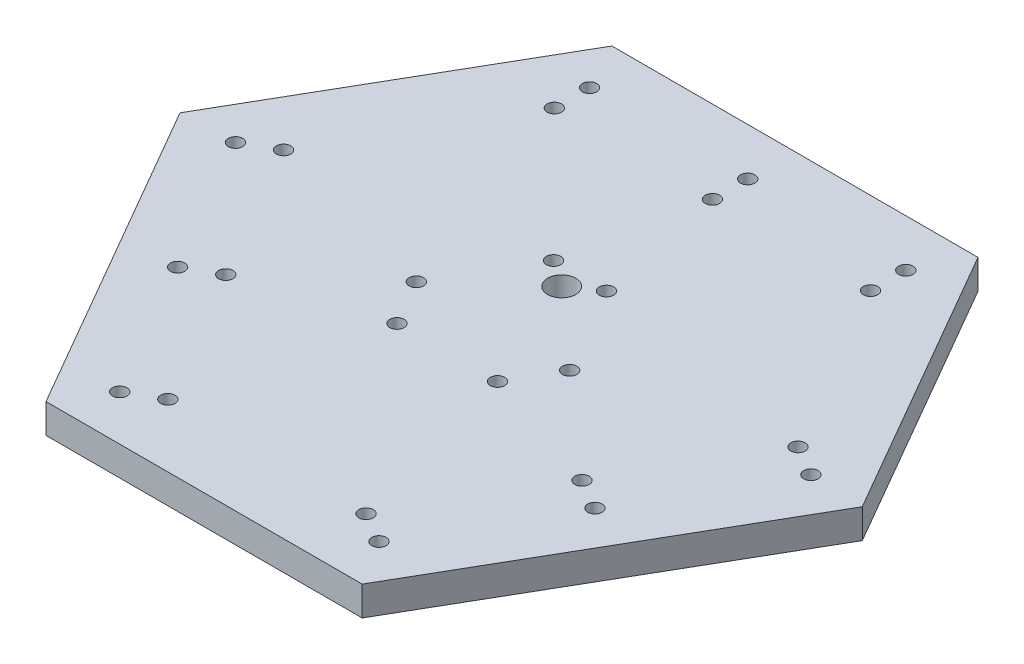
ISO-10303-21;
HEADER;
FILE_DESCRIPTION(('STEP AP214'),'2;1');
FILE_NAME('part.step','',(''),(''),'','','');
FILE_SCHEMA(('AUTOMOTIVE_DESIGN { 1 0 10303 214 1 1 1 1 }'));
ENDSEC;
DATA;
#1=APPLICATION_CONTEXT('core data for automotive mechanical design processes');
#2=APPLICATION_PROTOCOL_DEFINITION('international standard','automotive_design',2000,#1);
#3=PRODUCT_CONTEXT('',#1,'mechanical');
#4=PRODUCT('Part','Part','',(#3));
#5=PRODUCT_RELATED_PRODUCT_CATEGORY('part','',(#4));
#6=PRODUCT_DEFINITION_FORMATION('','',#4);
#7=PRODUCT_DEFINITION_CONTEXT('part definition',#1,'design');
#8=PRODUCT_DEFINITION('design','',#6,#7);
#9=PRODUCT_DEFINITION_SHAPE('','',#8);
#10=(LENGTH_UNIT() NAMED_UNIT(*) SI_UNIT(.MILLI.,.METRE.));
#11=(NAMED_UNIT(*) PLANE_ANGLE_UNIT() SI_UNIT($,.RADIAN.));
#12=(NAMED_UNIT(*) SI_UNIT($,.STERADIAN.) SOLID_ANGLE_UNIT());
#13=UNCERTAINTY_MEASURE_WITH_UNIT(LENGTH_MEASURE(1.E-05),#10,'distance_accuracy_value','');
#14=(GEOMETRIC_REPRESENTATION_CONTEXT(3) GLOBAL_UNCERTAINTY_ASSIGNED_CONTEXT((#13)) GLOBAL_UNIT_ASSIGNED_CONTEXT((#10,
#11,#12)) REPRESENTATION_CONTEXT('',''));
#15=CARTESIAN_POINT('',(0.,0.,0.));
#16=DIRECTION('',(0.,0.,1.));
#17=DIRECTION('',(1.,0.,0.));
#18=AXIS2_PLACEMENT_3D('',#15,#16,#17);
#19=CARTESIAN_POINT('',(0.,10.,196.299091524473));
#20=DIRECTION('',(-0.866025403784439,0.,-0.5));
#21=DIRECTION('',(-0.5,0.,0.866025403784439));
#22=AXIS2_PLACEMENT_3D('',#19,#20,#21);
#23=PLANE('',#22);
#24=DIRECTION('',(0.,1.,0.));
#25=VECTOR('',#24,1.);
#26=CARTESIAN_POINT('',(53.8333333333334,10.,103.057023050348));
#27=LINE('',#26,#25);
#28=CARTESIAN_POINT('',(53.8333333333333,0.,103.057023050348));
#29=VERTEX_POINT('',#28);
#30=CARTESIAN_POINT('',(53.8333333333333,10.,103.057023050348));
#31=VERTEX_POINT('',#30);
#32=EDGE_CURVE('E119',#29,#31,#27,.T.);
#33=ORIENTED_EDGE('',*,*,#32,.F.);
#34=DIRECTION('',(0.5,0.,-0.866025403784439));
#35=VECTOR('',#34,1.);
#36=CARTESIAN_POINT('',(0.,0.,196.299091524473));
#37=LINE('',#36,#35);
#38=CARTESIAN_POINT('',(116.166666666667,0.,-4.90747728811164));
#39=VERTEX_POINT('',#38);
#40=EDGE_CURVE('E104',#29,#39,#37,.T.);
#41=ORIENTED_EDGE('',*,*,#40,.T.);
#42=DIRECTION('',(0.,-1.,0.));
#43=VECTOR('',#42,1.);
#44=CARTESIAN_POINT('',(116.166666666667,10.,-4.90747728811175));
#45=LINE('',#44,#43);
#46=CARTESIAN_POINT('',(116.166666666667,10.,-4.90747728811169));
#47=VERTEX_POINT('',#46);
#48=EDGE_CURVE('E87',#47,#39,#45,.T.);
#49=ORIENTED_EDGE('',*,*,#48,.F.);
#50=DIRECTION('',(0.5,0.,-0.866025403784439));
#51=VECTOR('',#50,1.);
#52=CARTESIAN_POINT('',(0.,10.,196.299091524473));
#53=LINE('',#52,#51);
#54=EDGE_CURVE('E102',#31,#47,#53,.T.);
#55=ORIENTED_EDGE('',*,*,#54,.F.);
#56=EDGE_LOOP('',(#33,#41,#49,#55));
#57=FACE_BOUND('',#56,.T.);
#58=ADVANCED_FACE('F34',(#57),#23,.F.);
#59=CARTESIAN_POINT('',(170.,10.,-98.1495457622364));
#60=DIRECTION('',(0.,0.,1.));
#61=DIRECTION('',(1.,0.,0.));
#62=AXIS2_PLACEMENT_3D('',#59,#60,#61);
#63=PLANE('',#62);
#64=DIRECTION('',(0.,-1.,0.));
#65=VECTOR('',#64,1.);
#66=CARTESIAN_POINT('',(-62.3333333333334,10.,-98.1495457622364));
#67=LINE('',#66,#65);
#68=CARTESIAN_POINT('',(-62.3333333333334,10.,-98.1495457622364));
#69=VERTEX_POINT('',#68);
#70=CARTESIAN_POINT('',(-62.3333333333333,0.,-98.1495457622364));
#71=VERTEX_POINT('',#70);
#72=EDGE_CURVE('E48',#69,#71,#67,.T.);
#73=ORIENTED_EDGE('',*,*,#72,.F.);
#74=DIRECTION('',(-1.,0.,0.));
#75=VECTOR('',#74,1.);
#76=CARTESIAN_POINT('',(170.,10.,-98.1495457622364));
#77=LINE('',#76,#75);
#78=CARTESIAN_POINT('',(62.3333333333333,10.,-98.1495457622364));
#79=VERTEX_POINT('',#78);
#80=EDGE_CURVE('E110',#79,#69,#77,.T.);
#81=ORIENTED_EDGE('',*,*,#80,.F.);
#82=DIRECTION('',(0.,1.,0.));
#83=VECTOR('',#82,1.);
#84=CARTESIAN_POINT('',(62.3333333333333,10.,-98.1495457622364));
#85=LINE('',#84,#83);
#86=CARTESIAN_POINT('',(62.3333333333333,0.,-98.1495457622364));
#87=VERTEX_POINT('',#86);
#88=EDGE_CURVE('E90',#87,#79,#85,.T.);
#89=ORIENTED_EDGE('',*,*,#88,.F.);
#90=DIRECTION('',(-1.,0.,0.));
#91=VECTOR('',#90,1.);
#92=CARTESIAN_POINT('',(170.,0.,-98.1495457622364));
#93=LINE('',#92,#91);
#94=EDGE_CURVE('E116',#87,#71,#93,.T.);
#95=ORIENTED_EDGE('',*,*,#94,.T.);
#96=EDGE_LOOP('',(#73,#81,#89,#95));
#97=FACE_BOUND('',#96,.T.);
#98=ADVANCED_FACE('F371',(#97),#63,.F.);
#99=CARTESIAN_POINT('',(-170.,10.,-98.1495457622364));
#100=DIRECTION('',(0.866025403784439,0.,-0.5));
#101=DIRECTION('',(-0.5,0.,-0.866025403784439));
#102=AXIS2_PLACEMENT_3D('',#99,#100,#101);
#103=PLANE('',#102);
#104=DIRECTION('',(0.,-1.,0.));
#105=VECTOR('',#104,1.);
#106=CARTESIAN_POINT('',(-53.8333333333333,10.,103.057023050348));
#107=LINE('',#106,#105);
#108=CARTESIAN_POINT('',(-53.8333333333333,10.,103.057023050348));
#109=VERTEX_POINT('',#108);
#110=CARTESIAN_POINT('',(-53.8333333333333,0.,103.057023050348));
#111=VERTEX_POINT('',#110);
#112=EDGE_CURVE('E55',#109,#111,#107,.T.);
#113=ORIENTED_EDGE('',*,*,#112,.F.);
#114=DIRECTION('',(0.5,0.,0.866025403784439));
#115=VECTOR('',#114,1.);
#116=CARTESIAN_POINT('',(-170.,10.,-98.1495457622364));
#117=LINE('',#116,#115);
#118=CARTESIAN_POINT('',(-116.166666666667,10.,-4.90747728811181));
#119=VERTEX_POINT('',#118);
#120=EDGE_CURVE('E113',#119,#109,#117,.T.);
#121=ORIENTED_EDGE('',*,*,#120,.F.);
#122=DIRECTION('',(0.,1.,0.));
#123=VECTOR('',#122,1.);
#124=CARTESIAN_POINT('',(-116.166666666667,10.,-4.90747728811187));
#125=LINE('',#124,#123);
#126=CARTESIAN_POINT('',(-116.166666666667,0.,-4.90747728811181));
#127=VERTEX_POINT('',#126);
#128=EDGE_CURVE('E105',#127,#119,#125,.T.);
#129=ORIENTED_EDGE('',*,*,#128,.F.);
#130=DIRECTION('',(0.5,0.,0.866025403784439));
#131=VECTOR('',#130,1.);
#132=CARTESIAN_POINT('',(-170.,0.,-98.1495457622364));
#133=LINE('',#132,#131);
#134=EDGE_CURVE('E111',#127,#111,#133,.T.);
#135=ORIENTED_EDGE('',*,*,#134,.T.);
#136=EDGE_LOOP('',(#113,#121,#129,#135));
#137=FACE_BOUND('',#136,.T.);
#138=ADVANCED_FACE('F135',(#137),#103,.F.);
#139=CARTESIAN_POINT('',(0.,10.,0.));
#140=DIRECTION('',(0.,1.,0.));
#141=DIRECTION('',(0.,0.,1.));
#142=AXIS2_PLACEMENT_3D('',#139,#140,#141);
#143=PLANE('',#142);
#144=CARTESIAN_POINT('',(26.1069404429791,10.,4.6805442470582));
#145=DIRECTION('',(0.,1.,0.));
#146=DIRECTION('',(0.,0.,1.));
#147=AXIS2_PLACEMENT_3D('',#144,#145,#146);
#148=CIRCLE('',#147,2.45);
#149=CARTESIAN_POINT('',(26.1069404429791,10.,7.1305442470582));
#150=VERTEX_POINT('',#149);
#151=EDGE_CURVE('E284',#150,#150,#148,.T.);
#152=ORIENTED_EDGE('',*,*,#151,.F.);
#153=EDGE_LOOP('',(#152));
#154=FACE_BOUND('',#153,.T.);
#155=CARTESIAN_POINT('',(9.,10.,-24.9495457622364));
#156=DIRECTION('',(0.,1.,0.));
#157=DIRECTION('',(0.,0.,1.));
#158=AXIS2_PLACEMENT_3D('',#155,#156,#157);
#159=CIRCLE('',#158,2.45);
#160=CARTESIAN_POINT('',(9.,10.,-22.4995457622364));
#161=VERTEX_POINT('',#160);
#162=EDGE_CURVE('E285',#161,#161,#159,.T.);
#163=ORIENTED_EDGE('',*,*,#162,.F.);
#164=EDGE_LOOP('',(#163));
#165=FACE_BOUND('',#164,.T.);
#166=CARTESIAN_POINT('',(-9.00000000000001,10.,-24.9495457622364));
#167=DIRECTION('',(0.,1.,0.));
#168=DIRECTION('',(0.,0.,1.));
#169=AXIS2_PLACEMENT_3D('',#166,#167,#168);
#170=CIRCLE('',#169,2.45);
#171=CARTESIAN_POINT('',(-9.00000000000001,10.,-22.4995457622364));
#172=VERTEX_POINT('',#171);
#173=EDGE_CURVE('E259',#172,#172,#170,.T.);
#174=ORIENTED_EDGE('',*,*,#173,.F.);
#175=EDGE_LOOP('',(#174));
#176=FACE_BOUND('',#175,.T.);
#177=CARTESIAN_POINT('',(-26.1069404429791,10.,4.68054424705822));
#178=DIRECTION('',(0.,1.,0.));
#179=DIRECTION('',(0.,0.,1.));
#180=AXIS2_PLACEMENT_3D('',#177,#178,#179);
#181=CIRCLE('',#180,2.45);
#182=CARTESIAN_POINT('',(-26.1069404429791,10.,7.13054424705822));
#183=VERTEX_POINT('',#182);
#184=EDGE_CURVE('E266',#183,#183,#181,.T.);
#185=ORIENTED_EDGE('',*,*,#184,.F.);
#186=EDGE_LOOP('',(#185));
#187=FACE_BOUND('',#186,.T.);
#188=CARTESIAN_POINT('',(-17.1069404429791,10.,20.2690015151781));
#189=DIRECTION('',(0.,1.,0.));
#190=DIRECTION('',(0.,0.,1.));
#191=AXIS2_PLACEMENT_3D('',#188,#189,#190);
#192=CIRCLE('',#191,2.45);
#193=CARTESIAN_POINT('',(-17.1069404429791,10.,22.7190015151781));
#194=VERTEX_POINT('',#193);
#195=EDGE_CURVE('E272',#194,#194,#192,.T.);
#196=ORIENTED_EDGE('',*,*,#195,.F.);
#197=EDGE_LOOP('',(#196));
#198=FACE_BOUND('',#197,.T.);
#199=CARTESIAN_POINT('',(17.1069404429791,10.,20.2690015151781));
#200=DIRECTION('',(0.,1.,0.));
#201=DIRECTION('',(0.,0.,1.));
#202=AXIS2_PLACEMENT_3D('',#199,#200,#201);
#203=CIRCLE('',#202,2.45);
#204=CARTESIAN_POINT('',(17.1069404429791,10.,22.7190015151781));
#205=VERTEX_POINT('',#204);
#206=EDGE_CURVE('E278',#205,#205,#203,.T.);
#207=ORIENTED_EDGE('',*,*,#206,.F.);
#208=EDGE_LOOP('',(#207));
#209=FACE_BOUND('',#208,.T.);
#210=CARTESIAN_POINT('',(97.9773861328657,10.,-5.60271925044493));
#211=DIRECTION('',(0.,1.,0.));
#212=DIRECTION('',(0.,0.,1.));
#213=AXIS2_PLACEMENT_3D('',#210,#211,#212);
#214=CIRCLE('',#213,2.45);
#215=CARTESIAN_POINT('',(97.9773861328657,10.,-3.15271925044493));
#216=VERTEX_POINT('',#215);
#217=EDGE_CURVE('E217',#216,#216,#214,.T.);
#218=ORIENTED_EDGE('',*,*,#217,.F.);
#219=EDGE_LOOP('',(#218));
#220=FACE_BOUND('',#219,.T.);
#221=CARTESIAN_POINT('',(53.8407902675903,10.,-70.0495457622364));
#222=DIRECTION('',(0.,1.,0.));
#223=DIRECTION('',(0.,0.,1.));
#224=AXIS2_PLACEMENT_3D('',#221,#222,#223);
#225=CIRCLE('',#224,2.45);
#226=CARTESIAN_POINT('',(53.8407902675903,10.,-67.5995457622364));
#227=VERTEX_POINT('',#226);
#228=EDGE_CURVE('E224',#227,#227,#225,.T.);
#229=ORIENTED_EDGE('',*,*,#228,.F.);
#230=EDGE_LOOP('',(#229));
#231=FACE_BOUND('',#230,.T.);
#232=CARTESIAN_POINT('',(53.8407902675903,10.,-82.0495457622364));
#233=DIRECTION('',(0.,1.,0.));
#234=DIRECTION('',(0.,0.,1.));
#235=AXIS2_PLACEMENT_3D('',#232,#233,#234);
#236=CIRCLE('',#235,2.45000000000001);
#237=CARTESIAN_POINT('',(53.8407902675903,10.,-79.5995457622364));
#238=VERTEX_POINT('',#237);
#239=EDGE_CURVE('E205',#238,#238,#236,.T.);
#240=ORIENTED_EDGE('',*,*,#239,.F.);
#241=EDGE_LOOP('',(#240));
#242=FACE_BOUND('',#241,.T.);
#243=CARTESIAN_POINT('',(-97.9773861328657,10.,-5.60271925044487));
#244=DIRECTION('',(0.,1.,0.));
#245=DIRECTION('',(0.,0.,1.));
#246=AXIS2_PLACEMENT_3D('',#243,#244,#245);
#247=CIRCLE('',#246,2.45);
#248=CARTESIAN_POINT('',(-97.9773861328657,10.,-3.15271925044487));
#249=VERTEX_POINT('',#248);
#250=EDGE_CURVE('E212',#249,#249,#247,.T.);
#251=ORIENTED_EDGE('',*,*,#250,.F.);
#252=EDGE_LOOP('',(#251));
#253=FACE_BOUND('',#252,.T.);
#254=CARTESIAN_POINT('',(87.5850812874524,10.,-11.6027192504449));
#255=DIRECTION('',(0.,1.,0.));
#256=DIRECTION('',(0.,0.,1.));
#257=AXIS2_PLACEMENT_3D('',#254,#255,#256);
#258=CIRCLE('',#257,2.45);
#259=CARTESIAN_POINT('',(87.5850812874524,10.,-9.15271925044494));
#260=VERTEX_POINT('',#259);
#261=EDGE_CURVE('E248',#260,#260,#258,.T.);
#262=ORIENTED_EDGE('',*,*,#261,.F.);
#263=EDGE_LOOP('',(#262));
#264=FACE_BOUND('',#263,.T.);
#265=CARTESIAN_POINT('',(44.1365958652754,10.,87.6522650126813));
#266=DIRECTION('',(0.,1.,0.));
#267=DIRECTION('',(0.,0.,1.));
#268=AXIS2_PLACEMENT_3D('',#265,#266,#267);
#269=CIRCLE('',#268,2.45);
#270=CARTESIAN_POINT('',(44.1365958652754,10.,90.1022650126813));
#271=VERTEX_POINT('',#270);
#272=EDGE_CURVE('E242',#271,#271,#269,.T.);
#273=ORIENTED_EDGE('',*,*,#272,.F.);
#274=EDGE_LOOP('',(#273));
#275=FACE_BOUND('',#274,.T.);
#276=CARTESIAN_POINT('',(33.7442910198621,10.,81.6522650126813));
#277=DIRECTION('',(0.,1.,0.));
#278=DIRECTION('',(0.,0.,1.));
#279=AXIS2_PLACEMENT_3D('',#276,#277,#278);
#280=CIRCLE('',#279,2.45);
#281=CARTESIAN_POINT('',(33.7442910198621,10.,84.1022650126813));
#282=VERTEX_POINT('',#281);
#283=EDGE_CURVE('E236',#282,#282,#280,.T.);
#284=ORIENTED_EDGE('',*,*,#283,.F.);
#285=EDGE_LOOP('',(#284));
#286=FACE_BOUND('',#285,.T.);
#287=CARTESIAN_POINT('',(-33.7442910198621,10.,81.6522650126813));
#288=DIRECTION('',(0.,1.,0.));
#289=DIRECTION('',(0.,0.,1.));
#290=AXIS2_PLACEMENT_3D('',#287,#288,#289);
#291=CIRCLE('',#290,2.45);
#292=CARTESIAN_POINT('',(-33.7442910198621,10.,84.1022650126813));
#293=VERTEX_POINT('',#292);
#294=EDGE_CURVE('E229',#293,#293,#291,.T.);
#295=ORIENTED_EDGE('',*,*,#294,.F.);
#296=EDGE_LOOP('',(#295));
#297=FACE_BOUND('',#296,.T.);
#298=CARTESIAN_POINT('',(-53.8407902675903,10.,-82.0495457622364));
#299=DIRECTION('',(0.,1.,0.));
#300=DIRECTION('',(0.,0.,1.));
#301=AXIS2_PLACEMENT_3D('',#298,#299,#300);
#302=CIRCLE('',#301,2.45000000000001);
#303=CARTESIAN_POINT('',(-53.8407902675903,10.,-79.5995457622364));
#304=VERTEX_POINT('',#303);
#305=EDGE_CURVE('E176',#304,#304,#302,.T.);
#306=ORIENTED_EDGE('',*,*,#305,.F.);
#307=EDGE_LOOP('',(#306));
#308=FACE_BOUND('',#307,.T.);
#309=CARTESIAN_POINT('',(0.,10.,-70.0495457622364));
#310=DIRECTION('',(0.,1.,0.));
#311=DIRECTION('',(0.,0.,1.));
#312=AXIS2_PLACEMENT_3D('',#309,#310,#311);
#313=CIRCLE('',#312,2.45);
#314=CARTESIAN_POINT('',(0.,10.,-67.5995457622364));
#315=VERTEX_POINT('',#314);
#316=EDGE_CURVE('E170',#315,#315,#313,.T.);
#317=ORIENTED_EDGE('',*,*,#316,.F.);
#318=EDGE_LOOP('',(#317));
#319=FACE_BOUND('',#318,.T.);
#320=CARTESIAN_POINT('',(71.0569909990705,10.,41.0247728811182));
#321=DIRECTION('',(0.,1.,0.));
#322=DIRECTION('',(0.,0.,1.));
#323=AXIS2_PLACEMENT_3D('',#320,#321,#322);
#324=CIRCLE('',#323,2.45000000000001);
#325=CARTESIAN_POINT('',(71.0569909990705,10.,43.4747728811182));
#326=VERTEX_POINT('',#325);
#327=EDGE_CURVE('E164',#326,#326,#324,.T.);
#328=ORIENTED_EDGE('',*,*,#327,.F.);
#329=EDGE_LOOP('',(#328));
#330=FACE_BOUND('',#329,.T.);
#331=CARTESIAN_POINT('',(60.6646861536573,10.,35.0247728811182));
#332=DIRECTION('',(0.,1.,0.));
#333=DIRECTION('',(0.,0.,1.));
#334=AXIS2_PLACEMENT_3D('',#331,#332,#333);
#335=CIRCLE('',#334,2.45);
#336=CARTESIAN_POINT('',(60.6646861536573,10.,37.4747728811182));
#337=VERTEX_POINT('',#336);
#338=EDGE_CURVE('E157',#337,#337,#335,.T.);
#339=ORIENTED_EDGE('',*,*,#338,.F.);
#340=EDGE_LOOP('',(#339));
#341=FACE_BOUND('',#340,.T.);
#342=CARTESIAN_POINT('',(-71.0569909990705,10.,41.0247728811182));
#343=DIRECTION('',(0.,1.,0.));
#344=DIRECTION('',(0.,0.,1.));
#345=AXIS2_PLACEMENT_3D('',#342,#343,#344);
#346=CIRCLE('',#345,2.45);
#347=CARTESIAN_POINT('',(-71.0569909990705,10.,43.4747728811182));
#348=VERTEX_POINT('',#347);
#349=EDGE_CURVE('E200',#348,#348,#346,.T.);
#350=ORIENTED_EDGE('',*,*,#349,.F.);
#351=EDGE_LOOP('',(#350));
#352=FACE_BOUND('',#351,.T.);
#353=CARTESIAN_POINT('',(-60.6646861536573,10.,35.0247728811182));
#354=DIRECTION('',(0.,1.,0.));
#355=DIRECTION('',(0.,0.,1.));
#356=AXIS2_PLACEMENT_3D('',#353,#354,#355);
#357=CIRCLE('',#356,2.45);
#358=CARTESIAN_POINT('',(-60.6646861536573,10.,37.4747728811182));
#359=VERTEX_POINT('',#358);
#360=EDGE_CURVE('E194',#359,#359,#357,.T.);
#361=ORIENTED_EDGE('',*,*,#360,.F.);
#362=EDGE_LOOP('',(#361));
#363=FACE_BOUND('',#362,.T.);
#364=CARTESIAN_POINT('',(-53.8407902675903,10.,-70.0495457622364));
#365=DIRECTION('',(0.,1.,0.));
#366=DIRECTION('',(0.,0.,1.));
#367=AXIS2_PLACEMENT_3D('',#364,#365,#366);
#368=CIRCLE('',#367,2.45);
#369=CARTESIAN_POINT('',(-53.8407902675903,10.,-67.5995457622364));
#370=VERTEX_POINT('',#369);
#371=EDGE_CURVE('E188',#370,#370,#368,.T.);
#372=ORIENTED_EDGE('',*,*,#371,.F.);
#373=EDGE_LOOP('',(#372));
#374=FACE_BOUND('',#373,.T.);
#375=CARTESIAN_POINT('',(-87.5850812874524,10.,-11.6027192504449));
#376=DIRECTION('',(0.,1.,0.));
#377=DIRECTION('',(0.,0.,1.));
#378=AXIS2_PLACEMENT_3D('',#375,#376,#377);
#379=CIRCLE('',#378,2.45);
#380=CARTESIAN_POINT('',(-87.5850812874524,10.,-9.15271925044489));
#381=VERTEX_POINT('',#380);
#382=EDGE_CURVE('E181',#381,#381,#379,.T.);
#383=ORIENTED_EDGE('',*,*,#382,.F.);
#384=EDGE_LOOP('',(#383));
#385=FACE_BOUND('',#384,.T.);
#386=CARTESIAN_POINT('',(-44.1365958652753,10.,87.6522650126813));
#387=DIRECTION('',(0.,1.,0.));
#388=DIRECTION('',(0.,0.,1.));
#389=AXIS2_PLACEMENT_3D('',#386,#387,#388);
#390=CIRCLE('',#389,2.45000000000001);
#391=CARTESIAN_POINT('',(-44.1365958652753,10.,90.1022650126813));
#392=VERTEX_POINT('',#391);
#393=EDGE_CURVE('E253',#392,#392,#390,.T.);
#394=ORIENTED_EDGE('',*,*,#393,.F.);
#395=EDGE_LOOP('',(#394));
#396=FACE_BOUND('',#395,.T.);
#397=CARTESIAN_POINT('',(0.,10.,-82.0495457622364));
#398=DIRECTION('',(0.,1.,0.));
#399=DIRECTION('',(0.,0.,1.));
#400=AXIS2_PLACEMENT_3D('',#397,#398,#399);
#401=CIRCLE('',#400,2.45);
#402=CARTESIAN_POINT('',(0.,10.,-79.5995457622364));
#403=VERTEX_POINT('',#402);
#404=EDGE_CURVE('E151',#403,#403,#401,.T.);
#405=ORIENTED_EDGE('',*,*,#404,.F.);
#406=EDGE_LOOP('',(#405));
#407=FACE_BOUND('',#406,.T.);
#408=CARTESIAN_POINT('',(0.,10.,-18.7137234561684));
#409=DIRECTION('',(0.,1.,0.));
#410=DIRECTION('',(0.,0.,1.));
#411=AXIS2_PLACEMENT_3D('',#408,#409,#410);
#412=CIRCLE('',#411,4.80066582730917);
#413=CARTESIAN_POINT('',(0.,10.,-13.9130576288592));
#414=VERTEX_POINT('',#413);
#415=EDGE_CURVE('E145',#414,#414,#412,.T.);
#416=ORIENTED_EDGE('',*,*,#415,.F.);
#417=EDGE_LOOP('',(#416));
#418=FACE_BOUND('',#417,.T.);
#419=ORIENTED_EDGE('',*,*,#120,.T.);
#420=DIRECTION('',(1.,0.,0.));
#421=VECTOR('',#420,1.);
#422=CARTESIAN_POINT('',(-178.5,10.,103.057023050348));
#423=LINE('',#422,#421);
#424=EDGE_CURVE('E96',#109,#31,#423,.T.);
#425=ORIENTED_EDGE('',*,*,#424,.T.);
#426=ORIENTED_EDGE('',*,*,#54,.T.);
#427=DIRECTION('',(-0.5,0.,-0.866025403784439));
#428=VECTOR('',#427,1.);
#429=CARTESIAN_POINT('',(178.5,10.,103.057023050348));
#430=LINE('',#429,#428);
#431=EDGE_CURVE('E84',#47,#79,#430,.T.);
#432=ORIENTED_EDGE('',*,*,#431,.T.);
#433=ORIENTED_EDGE('',*,*,#80,.T.);
#434=DIRECTION('',(-0.5,0.,0.866025403784439));
#435=VECTOR('',#434,1.);
#436=CARTESIAN_POINT('',(0.,10.,-206.114046100696));
#437=LINE('',#436,#435);
#438=EDGE_CURVE('E95',#69,#119,#437,.T.);
#439=ORIENTED_EDGE('',*,*,#438,.T.);
#440=EDGE_LOOP('',(#419,#425,#426,#432,#433,#439));
#441=FACE_BOUND('',#440,.T.);
#442=ADVANCED_FACE('F109',(#154,#165,#176,#187,#198,#209,#220,#231,#242,#253,#264,#275,#286,
#297,#308,#319,#330,#341,#352,#363,#374,#385,#396,#407,#418,#441),#143,.T.);
#443=CARTESIAN_POINT('',(0.,0.,0.));
#444=DIRECTION('',(0.,1.,0.));
#445=DIRECTION('',(0.,0.,1.));
#446=AXIS2_PLACEMENT_3D('',#443,#444,#445);
#447=PLANE('',#446);
#448=CARTESIAN_POINT('',(26.1069404429791,0.,4.6805442470582));
#449=DIRECTION('',(0.,1.,0.));
#450=DIRECTION('',(0.,0.,1.));
#451=AXIS2_PLACEMENT_3D('',#448,#449,#450);
#452=CIRCLE('',#451,2.45);
#453=CARTESIAN_POINT('',(26.1069404429791,0.,7.1305442470582));
#454=VERTEX_POINT('',#453);
#455=EDGE_CURVE('E256',#454,#454,#452,.T.);
#456=ORIENTED_EDGE('',*,*,#455,.T.);
#457=EDGE_LOOP('',(#456));
#458=FACE_BOUND('',#457,.T.);
#459=CARTESIAN_POINT('',(9.,0.,-24.9495457622364));
#460=DIRECTION('',(0.,1.,0.));
#461=DIRECTION('',(0.,0.,1.));
#462=AXIS2_PLACEMENT_3D('',#459,#460,#461);
#463=CIRCLE('',#462,2.45);
#464=CARTESIAN_POINT('',(9.,0.,-22.4995457622364));
#465=VERTEX_POINT('',#464);
#466=EDGE_CURVE('E263',#465,#465,#463,.T.);
#467=ORIENTED_EDGE('',*,*,#466,.T.);
#468=EDGE_LOOP('',(#467));
#469=FACE_BOUND('',#468,.T.);
#470=CARTESIAN_POINT('',(-9.00000000000001,0.,-24.9495457622364));
#471=DIRECTION('',(0.,1.,0.));
#472=DIRECTION('',(0.,0.,1.));
#473=AXIS2_PLACEMENT_3D('',#470,#471,#472);
#474=CIRCLE('',#473,2.45);
#475=CARTESIAN_POINT('',(-9.00000000000001,0.,-22.4995457622364));
#476=VERTEX_POINT('',#475);
#477=EDGE_CURVE('E262',#476,#476,#474,.T.);
#478=ORIENTED_EDGE('',*,*,#477,.T.);
#479=EDGE_LOOP('',(#478));
#480=FACE_BOUND('',#479,.T.);
#481=CARTESIAN_POINT('',(-26.1069404429791,0.,4.68054424705822));
#482=DIRECTION('',(0.,1.,0.));
#483=DIRECTION('',(0.,0.,1.));
#484=AXIS2_PLACEMENT_3D('',#481,#482,#483);
#485=CIRCLE('',#484,2.45);
#486=CARTESIAN_POINT('',(-26.1069404429791,0.,7.13054424705822));
#487=VERTEX_POINT('',#486);
#488=EDGE_CURVE('E269',#487,#487,#485,.T.);
#489=ORIENTED_EDGE('',*,*,#488,.T.);
#490=EDGE_LOOP('',(#489));
#491=FACE_BOUND('',#490,.T.);
#492=CARTESIAN_POINT('',(-17.1069404429791,0.,20.2690015151781));
#493=DIRECTION('',(0.,1.,0.));
#494=DIRECTION('',(0.,0.,1.));
#495=AXIS2_PLACEMENT_3D('',#492,#493,#494);
#496=CIRCLE('',#495,2.45);
#497=CARTESIAN_POINT('',(-17.1069404429791,0.,22.7190015151781));
#498=VERTEX_POINT('',#497);
#499=EDGE_CURVE('E275',#498,#498,#496,.T.);
#500=ORIENTED_EDGE('',*,*,#499,.T.);
#501=EDGE_LOOP('',(#500));
#502=FACE_BOUND('',#501,.T.);
#503=CARTESIAN_POINT('',(17.1069404429791,0.,20.2690015151781));
#504=DIRECTION('',(0.,1.,0.));
#505=DIRECTION('',(0.,0.,1.));
#506=AXIS2_PLACEMENT_3D('',#503,#504,#505);
#507=CIRCLE('',#506,2.45);
#508=CARTESIAN_POINT('',(17.1069404429791,0.,22.7190015151781));
#509=VERTEX_POINT('',#508);
#510=EDGE_CURVE('E281',#509,#509,#507,.T.);
#511=ORIENTED_EDGE('',*,*,#510,.T.);
#512=EDGE_LOOP('',(#511));
#513=FACE_BOUND('',#512,.T.);
#514=CARTESIAN_POINT('',(97.9773861328657,0.,-5.60271925044493));
#515=DIRECTION('',(0.,1.,0.));
#516=DIRECTION('',(0.,0.,1.));
#517=AXIS2_PLACEMENT_3D('',#514,#515,#516);
#518=CIRCLE('',#517,2.45);
#519=CARTESIAN_POINT('',(97.9773861328657,0.,-3.15271925044493));
#520=VERTEX_POINT('',#519);
#521=EDGE_CURVE('E220',#520,#520,#518,.T.);
#522=ORIENTED_EDGE('',*,*,#521,.T.);
#523=EDGE_LOOP('',(#522));
#524=FACE_BOUND('',#523,.T.);
#525=CARTESIAN_POINT('',(53.8407902675903,0.,-70.0495457622364));
#526=DIRECTION('',(0.,1.,0.));
#527=DIRECTION('',(0.,0.,1.));
#528=AXIS2_PLACEMENT_3D('',#525,#526,#527);
#529=CIRCLE('',#528,2.45);
#530=CARTESIAN_POINT('',(53.8407902675903,0.,-67.5995457622364));
#531=VERTEX_POINT('',#530);
#532=EDGE_CURVE('E209',#531,#531,#529,.T.);
#533=ORIENTED_EDGE('',*,*,#532,.T.);
#534=EDGE_LOOP('',(#533));
#535=FACE_BOUND('',#534,.T.);
#536=CARTESIAN_POINT('',(53.8407902675903,0.,-82.0495457622364));
#537=DIRECTION('',(0.,1.,0.));
#538=DIRECTION('',(0.,0.,1.));
#539=AXIS2_PLACEMENT_3D('',#536,#537,#538);
#540=CIRCLE('',#539,2.45000000000001);
#541=CARTESIAN_POINT('',(53.8407902675903,0.,-79.5995457622364));
#542=VERTEX_POINT('',#541);
#543=EDGE_CURVE('E208',#542,#542,#540,.T.);
#544=ORIENTED_EDGE('',*,*,#543,.T.);
#545=EDGE_LOOP('',(#544));
#546=FACE_BOUND('',#545,.T.);
#547=CARTESIAN_POINT('',(-97.9773861328657,0.,-5.60271925044487));
#548=DIRECTION('',(0.,1.,0.));
#549=DIRECTION('',(0.,0.,1.));
#550=AXIS2_PLACEMENT_3D('',#547,#548,#549);
#551=CIRCLE('',#550,2.45);
#552=CARTESIAN_POINT('',(-97.9773861328657,0.,-3.15271925044487));
#553=VERTEX_POINT('',#552);
#554=EDGE_CURVE('E185',#553,#553,#551,.T.);
#555=ORIENTED_EDGE('',*,*,#554,.T.);
#556=EDGE_LOOP('',(#555));
#557=FACE_BOUND('',#556,.T.);
#558=CARTESIAN_POINT('',(87.5850812874524,0.,-11.6027192504449));
#559=DIRECTION('',(0.,1.,0.));
#560=DIRECTION('',(0.,0.,1.));
#561=AXIS2_PLACEMENT_3D('',#558,#559,#560);
#562=CIRCLE('',#561,2.45);
#563=CARTESIAN_POINT('',(87.5850812874524,0.,-9.15271925044494));
#564=VERTEX_POINT('',#563);
#565=EDGE_CURVE('E221',#564,#564,#562,.T.);
#566=ORIENTED_EDGE('',*,*,#565,.T.);
#567=EDGE_LOOP('',(#566));
#568=FACE_BOUND('',#567,.T.);
#569=CARTESIAN_POINT('',(44.1365958652754,0.,87.6522650126813));
#570=DIRECTION('',(0.,1.,0.));
#571=DIRECTION('',(0.,0.,1.));
#572=AXIS2_PLACEMENT_3D('',#569,#570,#571);
#573=CIRCLE('',#572,2.45);
#574=CARTESIAN_POINT('',(44.1365958652754,0.,90.1022650126813));
#575=VERTEX_POINT('',#574);
#576=EDGE_CURVE('E245',#575,#575,#573,.T.);
#577=ORIENTED_EDGE('',*,*,#576,.T.);
#578=EDGE_LOOP('',(#577));
#579=FACE_BOUND('',#578,.T.);
#580=CARTESIAN_POINT('',(33.7442910198621,0.,81.6522650126813));
#581=DIRECTION('',(0.,1.,0.));
#582=DIRECTION('',(0.,0.,1.));
#583=AXIS2_PLACEMENT_3D('',#580,#581,#582);
#584=CIRCLE('',#583,2.45);
#585=CARTESIAN_POINT('',(33.7442910198621,0.,84.1022650126813));
#586=VERTEX_POINT('',#585);
#587=EDGE_CURVE('E239',#586,#586,#584,.T.);
#588=ORIENTED_EDGE('',*,*,#587,.T.);
#589=EDGE_LOOP('',(#588));
#590=FACE_BOUND('',#589,.T.);
#591=CARTESIAN_POINT('',(-33.7442910198621,0.,81.6522650126813));
#592=DIRECTION('',(0.,1.,0.));
#593=DIRECTION('',(0.,0.,1.));
#594=AXIS2_PLACEMENT_3D('',#591,#592,#593);
#595=CIRCLE('',#594,2.45);
#596=CARTESIAN_POINT('',(-33.7442910198621,0.,84.1022650126813));
#597=VERTEX_POINT('',#596);
#598=EDGE_CURVE('E232',#597,#597,#595,.T.);
#599=ORIENTED_EDGE('',*,*,#598,.T.);
#600=EDGE_LOOP('',(#599));
#601=FACE_BOUND('',#600,.T.);
#602=CARTESIAN_POINT('',(-53.8407902675903,0.,-82.0495457622364));
#603=DIRECTION('',(0.,1.,0.));
#604=DIRECTION('',(0.,0.,1.));
#605=AXIS2_PLACEMENT_3D('',#602,#603,#604);
#606=CIRCLE('',#605,2.45000000000001);
#607=CARTESIAN_POINT('',(-53.8407902675903,0.,-79.5995457622364));
#608=VERTEX_POINT('',#607);
#609=EDGE_CURVE('E154',#608,#608,#606,.T.);
#610=ORIENTED_EDGE('',*,*,#609,.T.);
#611=EDGE_LOOP('',(#610));
#612=FACE_BOUND('',#611,.T.);
#613=CARTESIAN_POINT('',(0.,0.,-70.0495457622364));
#614=DIRECTION('',(0.,1.,0.));
#615=DIRECTION('',(0.,0.,1.));
#616=AXIS2_PLACEMENT_3D('',#613,#614,#615);
#617=CIRCLE('',#616,2.45);
#618=CARTESIAN_POINT('',(0.,0.,-67.5995457622364));
#619=VERTEX_POINT('',#618);
#620=EDGE_CURVE('E173',#619,#619,#617,.T.);
#621=ORIENTED_EDGE('',*,*,#620,.T.);
#622=EDGE_LOOP('',(#621));
#623=FACE_BOUND('',#622,.T.);
#624=CARTESIAN_POINT('',(71.0569909990705,0.,41.0247728811182));
#625=DIRECTION('',(0.,1.,0.));
#626=DIRECTION('',(0.,0.,1.));
#627=AXIS2_PLACEMENT_3D('',#624,#625,#626);
#628=CIRCLE('',#627,2.45000000000001);
#629=CARTESIAN_POINT('',(71.0569909990705,0.,43.4747728811182));
#630=VERTEX_POINT('',#629);
#631=EDGE_CURVE('E167',#630,#630,#628,.T.);
#632=ORIENTED_EDGE('',*,*,#631,.T.);
#633=EDGE_LOOP('',(#632));
#634=FACE_BOUND('',#633,.T.);
#635=CARTESIAN_POINT('',(60.6646861536573,0.,35.0247728811182));
#636=DIRECTION('',(0.,1.,0.));
#637=DIRECTION('',(0.,0.,1.));
#638=AXIS2_PLACEMENT_3D('',#635,#636,#637);
#639=CIRCLE('',#638,2.45);
#640=CARTESIAN_POINT('',(60.6646861536573,0.,37.4747728811182));
#641=VERTEX_POINT('',#640);
#642=EDGE_CURVE('E160',#641,#641,#639,.T.);
#643=ORIENTED_EDGE('',*,*,#642,.T.);
#644=EDGE_LOOP('',(#643));
#645=FACE_BOUND('',#644,.T.);
#646=CARTESIAN_POINT('',(-71.0569909990705,0.,41.0247728811182));
#647=DIRECTION('',(0.,1.,0.));
#648=DIRECTION('',(0.,0.,1.));
#649=AXIS2_PLACEMENT_3D('',#646,#647,#648);
#650=CIRCLE('',#649,2.45);
#651=CARTESIAN_POINT('',(-71.0569909990705,0.,43.4747728811182));
#652=VERTEX_POINT('',#651);
#653=EDGE_CURVE('E161',#652,#652,#650,.T.);
#654=ORIENTED_EDGE('',*,*,#653,.T.);
#655=EDGE_LOOP('',(#654));
#656=FACE_BOUND('',#655,.T.);
#657=CARTESIAN_POINT('',(-60.6646861536573,0.,35.0247728811182));
#658=DIRECTION('',(0.,1.,0.));
#659=DIRECTION('',(0.,0.,1.));
#660=AXIS2_PLACEMENT_3D('',#657,#658,#659);
#661=CIRCLE('',#660,2.45);
#662=CARTESIAN_POINT('',(-60.6646861536573,0.,37.4747728811182));
#663=VERTEX_POINT('',#662);
#664=EDGE_CURVE('E197',#663,#663,#661,.T.);
#665=ORIENTED_EDGE('',*,*,#664,.T.);
#666=EDGE_LOOP('',(#665));
#667=FACE_BOUND('',#666,.T.);
#668=CARTESIAN_POINT('',(-53.8407902675903,0.,-70.0495457622364));
#669=DIRECTION('',(0.,1.,0.));
#670=DIRECTION('',(0.,0.,1.));
#671=AXIS2_PLACEMENT_3D('',#668,#669,#670);
#672=CIRCLE('',#671,2.45);
#673=CARTESIAN_POINT('',(-53.8407902675903,0.,-67.5995457622364));
#674=VERTEX_POINT('',#673);
#675=EDGE_CURVE('E191',#674,#674,#672,.T.);
#676=ORIENTED_EDGE('',*,*,#675,.T.);
#677=EDGE_LOOP('',(#676));
#678=FACE_BOUND('',#677,.T.);
#679=CARTESIAN_POINT('',(-87.5850812874524,0.,-11.6027192504449));
#680=DIRECTION('',(0.,1.,0.));
#681=DIRECTION('',(0.,0.,1.));
#682=AXIS2_PLACEMENT_3D('',#679,#680,#681);
#683=CIRCLE('',#682,2.45);
#684=CARTESIAN_POINT('',(-87.5850812874524,0.,-9.15271925044489));
#685=VERTEX_POINT('',#684);
#686=EDGE_CURVE('E184',#685,#685,#683,.T.);
#687=ORIENTED_EDGE('',*,*,#686,.T.);
#688=EDGE_LOOP('',(#687));
#689=FACE_BOUND('',#688,.T.);
#690=CARTESIAN_POINT('',(-44.1365958652753,0.,87.6522650126813));
#691=DIRECTION('',(0.,1.,0.));
#692=DIRECTION('',(0.,0.,1.));
#693=AXIS2_PLACEMENT_3D('',#690,#691,#692);
#694=CIRCLE('',#693,2.45000000000001);
#695=CARTESIAN_POINT('',(-44.1365958652753,0.,90.1022650126813));
#696=VERTEX_POINT('',#695);
#697=EDGE_CURVE('E233',#696,#696,#694,.T.);
#698=ORIENTED_EDGE('',*,*,#697,.T.);
#699=EDGE_LOOP('',(#698));
#700=FACE_BOUND('',#699,.T.);
#701=CARTESIAN_POINT('',(0.,0.,-82.0495457622364));
#702=DIRECTION('',(0.,1.,0.));
#703=DIRECTION('',(0.,0.,1.));
#704=AXIS2_PLACEMENT_3D('',#701,#702,#703);
#705=CIRCLE('',#704,2.45);
#706=CARTESIAN_POINT('',(0.,0.,-79.5995457622364));
#707=VERTEX_POINT('',#706);
#708=EDGE_CURVE('E148',#707,#707,#705,.T.);
#709=ORIENTED_EDGE('',*,*,#708,.T.);
#710=EDGE_LOOP('',(#709));
#711=FACE_BOUND('',#710,.T.);
#712=CARTESIAN_POINT('',(0.,0.,-18.7137234561684));
#713=DIRECTION('',(0.,1.,0.));
#714=DIRECTION('',(0.,0.,1.));
#715=AXIS2_PLACEMENT_3D('',#712,#713,#714);
#716=CIRCLE('',#715,4.80066582730917);
#717=CARTESIAN_POINT('',(0.,0.,-13.9130576288592));
#718=VERTEX_POINT('',#717);
#719=EDGE_CURVE('E144',#718,#718,#716,.T.);
#720=ORIENTED_EDGE('',*,*,#719,.T.);
#721=EDGE_LOOP('',(#720));
#722=FACE_BOUND('',#721,.T.);
#723=DIRECTION('',(1.,0.,0.));
#724=VECTOR('',#723,1.);
#725=CARTESIAN_POINT('',(0.,0.,103.057023050348));
#726=LINE('',#725,#724);
#727=EDGE_CURVE('E12',#111,#29,#726,.T.);
#728=ORIENTED_EDGE('',*,*,#727,.F.);
#729=ORIENTED_EDGE('',*,*,#134,.F.);
#730=DIRECTION('',(-0.5,0.,0.866025403784439));
#731=VECTOR('',#730,1.);
#732=CARTESIAN_POINT('',(-89.25,0.,-51.5285115251741));
#733=LINE('',#732,#731);
#734=EDGE_CURVE('E41',#71,#127,#733,.T.);
#735=ORIENTED_EDGE('',*,*,#734,.F.);
#736=ORIENTED_EDGE('',*,*,#94,.F.);
#737=DIRECTION('',(-0.5,0.,-0.866025403784439));
#738=VECTOR('',#737,1.);
#739=CARTESIAN_POINT('',(89.25,0.,-51.5285115251741));
#740=LINE('',#739,#738);
#741=EDGE_CURVE('E123',#39,#87,#740,.T.);
#742=ORIENTED_EDGE('',*,*,#741,.F.);
#743=ORIENTED_EDGE('',*,*,#40,.F.);
#744=EDGE_LOOP('',(#728,#729,#735,#736,#742,#743));
#745=FACE_BOUND('',#744,.T.);
#746=ADVANCED_FACE('F137',(#458,#469,#480,#491,#502,#513,#524,#535,#546,#557,#568,#579,#590,
#601,#612,#623,#634,#645,#656,#667,#678,#689,#700,#711,#722,#745),#447,.F.);
#747=CARTESIAN_POINT('',(178.5,0.,103.057023050348));
#748=DIRECTION('',(0.866025403784439,0.,-0.5));
#749=DIRECTION('',(-0.5,0.,-0.866025403784439));
#750=AXIS2_PLACEMENT_3D('',#747,#748,#749);
#751=PLANE('',#750);
#752=ORIENTED_EDGE('',*,*,#48,.T.);
#753=ORIENTED_EDGE('',*,*,#741,.T.);
#754=ORIENTED_EDGE('',*,*,#88,.T.);
#755=ORIENTED_EDGE('',*,*,#431,.F.);
#756=EDGE_LOOP('',(#752,#753,#754,#755));
#757=FACE_BOUND('',#756,.T.);
#758=ADVANCED_FACE('F86',(#757),#751,.T.);
#759=CARTESIAN_POINT('',(0.,0.,-206.114046100696));
#760=DIRECTION('',(-0.866025403784439,0.,-0.5));
#761=DIRECTION('',(-0.5,0.,0.866025403784439));
#762=AXIS2_PLACEMENT_3D('',#759,#760,#761);
#763=PLANE('',#762);
#764=ORIENTED_EDGE('',*,*,#72,.T.);
#765=ORIENTED_EDGE('',*,*,#734,.T.);
#766=ORIENTED_EDGE('',*,*,#128,.T.);
#767=ORIENTED_EDGE('',*,*,#438,.F.);
#768=EDGE_LOOP('',(#764,#765,#766,#767));
#769=FACE_BOUND('',#768,.T.);
#770=ADVANCED_FACE('F128',(#769),#763,.T.);
#771=CARTESIAN_POINT('',(-178.5,0.,103.057023050348));
#772=DIRECTION('',(0.,0.,1.));
#773=DIRECTION('',(1.,0.,0.));
#774=AXIS2_PLACEMENT_3D('',#771,#772,#773);
#775=PLANE('',#774);
#776=ORIENTED_EDGE('',*,*,#32,.T.);
#777=ORIENTED_EDGE('',*,*,#424,.F.);
#778=ORIENTED_EDGE('',*,*,#112,.T.);
#779=ORIENTED_EDGE('',*,*,#727,.T.);
#780=EDGE_LOOP('',(#776,#777,#778,#779));
#781=FACE_BOUND('',#780,.T.);
#782=ADVANCED_FACE('F138',(#781),#775,.T.);
#783=CARTESIAN_POINT('',(0.,0.,-18.7137234561684));
#784=DIRECTION('',(0.,1.,0.));
#785=DIRECTION('',(0.,0.,1.));
#786=AXIS2_PLACEMENT_3D('',#783,#784,#785);
#787=CYLINDRICAL_SURFACE('',#786,4.80066582730917);
#788=ORIENTED_EDGE('',*,*,#719,.F.);
#789=EDGE_LOOP('',(#788));
#790=FACE_BOUND('',#789,.T.);
#791=ORIENTED_EDGE('',*,*,#415,.T.);
#792=EDGE_LOOP('',(#791));
#793=FACE_BOUND('',#792,.T.);
#794=ADVANCED_FACE('F355',(#790,#793),#787,.F.);
#795=CARTESIAN_POINT('',(0.,0.,-82.0495457622364));
#796=DIRECTION('',(0.,1.,0.));
#797=DIRECTION('',(0.,0.,1.));
#798=AXIS2_PLACEMENT_3D('',#795,#796,#797);
#799=CYLINDRICAL_SURFACE('',#798,2.45);
#800=ORIENTED_EDGE('',*,*,#708,.F.);
#801=EDGE_LOOP('',(#800));
#802=FACE_BOUND('',#801,.T.);
#803=ORIENTED_EDGE('',*,*,#404,.T.);
#804=EDGE_LOOP('',(#803));
#805=FACE_BOUND('',#804,.T.);
#806=ADVANCED_FACE('F357',(#802,#805),#799,.F.);
#807=CARTESIAN_POINT('',(-44.1365958652753,0.,87.6522650126813));
#808=DIRECTION('',(0.,1.,0.));
#809=DIRECTION('',(0.,0.,1.));
#810=AXIS2_PLACEMENT_3D('',#807,#808,#809);
#811=CYLINDRICAL_SURFACE('',#810,2.45000000000001);
#812=ORIENTED_EDGE('',*,*,#697,.F.);
#813=EDGE_LOOP('',(#812));
#814=FACE_BOUND('',#813,.T.);
#815=ORIENTED_EDGE('',*,*,#393,.T.);
#816=EDGE_LOOP('',(#815));
#817=FACE_BOUND('',#816,.T.);
#818=ADVANCED_FACE('F364',(#814,#817),#811,.F.);
#819=CARTESIAN_POINT('',(-87.5850812874524,0.,-11.6027192504449));
#820=DIRECTION('',(0.,1.,0.));
#821=DIRECTION('',(0.,0.,1.));
#822=AXIS2_PLACEMENT_3D('',#819,#820,#821);
#823=CYLINDRICAL_SURFACE('',#822,2.45);
#824=ORIENTED_EDGE('',*,*,#686,.F.);
#825=EDGE_LOOP('',(#824));
#826=FACE_BOUND('',#825,.T.);
#827=ORIENTED_EDGE('',*,*,#382,.T.);
#828=EDGE_LOOP('',(#827));
#829=FACE_BOUND('',#828,.T.);
#830=ADVANCED_FACE('F413',(#826,#829),#823,.F.);
#831=CARTESIAN_POINT('',(-53.8407902675903,0.,-70.0495457622364));
#832=DIRECTION('',(0.,1.,0.));
#833=DIRECTION('',(0.,0.,1.));
#834=AXIS2_PLACEMENT_3D('',#831,#832,#833);
#835=CYLINDRICAL_SURFACE('',#834,2.45);
#836=ORIENTED_EDGE('',*,*,#675,.F.);
#837=EDGE_LOOP('',(#836));
#838=FACE_BOUND('',#837,.T.);
#839=ORIENTED_EDGE('',*,*,#371,.T.);
#840=EDGE_LOOP('',(#839));
#841=FACE_BOUND('',#840,.T.);
#842=ADVANCED_FACE('F423',(#838,#841),#835,.F.);
#843=CARTESIAN_POINT('',(-60.6646861536573,0.,35.0247728811182));
#844=DIRECTION('',(0.,1.,0.));
#845=DIRECTION('',(0.,0.,1.));
#846=AXIS2_PLACEMENT_3D('',#843,#844,#845);
#847=CYLINDRICAL_SURFACE('',#846,2.45);
#848=ORIENTED_EDGE('',*,*,#664,.F.);
#849=EDGE_LOOP('',(#848));
#850=FACE_BOUND('',#849,.T.);
#851=ORIENTED_EDGE('',*,*,#360,.T.);
#852=EDGE_LOOP('',(#851));
#853=FACE_BOUND('',#852,.T.);
#854=ADVANCED_FACE('F433',(#850,#853),#847,.F.);
#855=CARTESIAN_POINT('',(-71.0569909990705,0.,41.0247728811182));
#856=DIRECTION('',(0.,1.,0.));
#857=DIRECTION('',(0.,0.,1.));
#858=AXIS2_PLACEMENT_3D('',#855,#856,#857);
#859=CYLINDRICAL_SURFACE('',#858,2.45);
#860=ORIENTED_EDGE('',*,*,#653,.F.);
#861=EDGE_LOOP('',(#860));
#862=FACE_BOUND('',#861,.T.);
#863=ORIENTED_EDGE('',*,*,#349,.T.);
#864=EDGE_LOOP('',(#863));
#865=FACE_BOUND('',#864,.T.);
#866=ADVANCED_FACE('F443',(#862,#865),#859,.F.);
#867=CARTESIAN_POINT('',(60.6646861536573,0.,35.0247728811182));
#868=DIRECTION('',(0.,1.,0.));
#869=DIRECTION('',(0.,0.,1.));
#870=AXIS2_PLACEMENT_3D('',#867,#868,#869);
#871=CYLINDRICAL_SURFACE('',#870,2.45);
#872=ORIENTED_EDGE('',*,*,#642,.F.);
#873=EDGE_LOOP('',(#872));
#874=FACE_BOUND('',#873,.T.);
#875=ORIENTED_EDGE('',*,*,#338,.T.);
#876=EDGE_LOOP('',(#875));
#877=FACE_BOUND('',#876,.T.);
#878=ADVANCED_FACE('F453',(#874,#877),#871,.F.);
#879=CARTESIAN_POINT('',(71.0569909990705,0.,41.0247728811182));
#880=DIRECTION('',(0.,1.,0.));
#881=DIRECTION('',(0.,0.,1.));
#882=AXIS2_PLACEMENT_3D('',#879,#880,#881);
#883=CYLINDRICAL_SURFACE('',#882,2.45000000000001);
#884=ORIENTED_EDGE('',*,*,#631,.F.);
#885=EDGE_LOOP('',(#884));
#886=FACE_BOUND('',#885,.T.);
#887=ORIENTED_EDGE('',*,*,#327,.T.);
#888=EDGE_LOOP('',(#887));
#889=FACE_BOUND('',#888,.T.);
#890=ADVANCED_FACE('F463',(#886,#889),#883,.F.);
#891=CARTESIAN_POINT('',(0.,0.,-70.0495457622364));
#892=DIRECTION('',(0.,1.,0.));
#893=DIRECTION('',(0.,0.,1.));
#894=AXIS2_PLACEMENT_3D('',#891,#892,#893);
#895=CYLINDRICAL_SURFACE('',#894,2.45);
#896=ORIENTED_EDGE('',*,*,#620,.F.);
#897=EDGE_LOOP('',(#896));
#898=FACE_BOUND('',#897,.T.);
#899=ORIENTED_EDGE('',*,*,#316,.T.);
#900=EDGE_LOOP('',(#899));
#901=FACE_BOUND('',#900,.T.);
#902=ADVANCED_FACE('F473',(#898,#901),#895,.F.);
#903=CARTESIAN_POINT('',(-53.8407902675903,0.,-82.0495457622364));
#904=DIRECTION('',(0.,1.,0.));
#905=DIRECTION('',(0.,0.,1.));
#906=AXIS2_PLACEMENT_3D('',#903,#904,#905);
#907=CYLINDRICAL_SURFACE('',#906,2.45000000000001);
#908=ORIENTED_EDGE('',*,*,#609,.F.);
#909=EDGE_LOOP('',(#908));
#910=FACE_BOUND('',#909,.T.);
#911=ORIENTED_EDGE('',*,*,#305,.T.);
#912=EDGE_LOOP('',(#911));
#913=FACE_BOUND('',#912,.T.);
#914=ADVANCED_FACE('F483',(#910,#913),#907,.F.);
#915=CARTESIAN_POINT('',(-33.7442910198621,0.,81.6522650126813));
#916=DIRECTION('',(0.,1.,0.));
#917=DIRECTION('',(0.,0.,1.));
#918=AXIS2_PLACEMENT_3D('',#915,#916,#917);
#919=CYLINDRICAL_SURFACE('',#918,2.45);
#920=ORIENTED_EDGE('',*,*,#598,.F.);
#921=EDGE_LOOP('',(#920));
#922=FACE_BOUND('',#921,.T.);
#923=ORIENTED_EDGE('',*,*,#294,.T.);
#924=EDGE_LOOP('',(#923));
#925=FACE_BOUND('',#924,.T.);
#926=ADVANCED_FACE('F493',(#922,#925),#919,.F.);
#927=CARTESIAN_POINT('',(33.7442910198621,0.,81.6522650126813));
#928=DIRECTION('',(0.,1.,0.));
#929=DIRECTION('',(0.,0.,1.));
#930=AXIS2_PLACEMENT_3D('',#927,#928,#929);
#931=CYLINDRICAL_SURFACE('',#930,2.45);
#932=ORIENTED_EDGE('',*,*,#587,.F.);
#933=EDGE_LOOP('',(#932));
#934=FACE_BOUND('',#933,.T.);
#935=ORIENTED_EDGE('',*,*,#283,.T.);
#936=EDGE_LOOP('',(#935));
#937=FACE_BOUND('',#936,.T.);
#938=ADVANCED_FACE('F503',(#934,#937),#931,.F.);
#939=CARTESIAN_POINT('',(44.1365958652754,0.,87.6522650126813));
#940=DIRECTION('',(0.,1.,0.));
#941=DIRECTION('',(0.,0.,1.));
#942=AXIS2_PLACEMENT_3D('',#939,#940,#941);
#943=CYLINDRICAL_SURFACE('',#942,2.45);
#944=ORIENTED_EDGE('',*,*,#576,.F.);
#945=EDGE_LOOP('',(#944));
#946=FACE_BOUND('',#945,.T.);
#947=ORIENTED_EDGE('',*,*,#272,.T.);
#948=EDGE_LOOP('',(#947));
#949=FACE_BOUND('',#948,.T.);
#950=ADVANCED_FACE('F513',(#946,#949),#943,.F.);
#951=CARTESIAN_POINT('',(87.5850812874524,0.,-11.6027192504449));
#952=DIRECTION('',(0.,1.,0.));
#953=DIRECTION('',(0.,0.,1.));
#954=AXIS2_PLACEMENT_3D('',#951,#952,#953);
#955=CYLINDRICAL_SURFACE('',#954,2.45);
#956=ORIENTED_EDGE('',*,*,#565,.F.);
#957=EDGE_LOOP('',(#956));
#958=FACE_BOUND('',#957,.T.);
#959=ORIENTED_EDGE('',*,*,#261,.T.);
#960=EDGE_LOOP('',(#959));
#961=FACE_BOUND('',#960,.T.);
#962=ADVANCED_FACE('F523',(#958,#961),#955,.F.);
#963=CARTESIAN_POINT('',(-97.9773861328657,0.,-5.60271925044487));
#964=DIRECTION('',(0.,1.,0.));
#965=DIRECTION('',(0.,0.,1.));
#966=AXIS2_PLACEMENT_3D('',#963,#964,#965);
#967=CYLINDRICAL_SURFACE('',#966,2.45);
#968=ORIENTED_EDGE('',*,*,#554,.F.);
#969=EDGE_LOOP('',(#968));
#970=FACE_BOUND('',#969,.T.);
#971=ORIENTED_EDGE('',*,*,#250,.T.);
#972=EDGE_LOOP('',(#971));
#973=FACE_BOUND('',#972,.T.);
#974=ADVANCED_FACE('F533',(#970,#973),#967,.F.);
#975=CARTESIAN_POINT('',(53.8407902675903,0.,-82.0495457622364));
#976=DIRECTION('',(0.,1.,0.));
#977=DIRECTION('',(0.,0.,1.));
#978=AXIS2_PLACEMENT_3D('',#975,#976,#977);
#979=CYLINDRICAL_SURFACE('',#978,2.45000000000001);
#980=ORIENTED_EDGE('',*,*,#543,.F.);
#981=EDGE_LOOP('',(#980));
#982=FACE_BOUND('',#981,.T.);
#983=ORIENTED_EDGE('',*,*,#239,.T.);
#984=EDGE_LOOP('',(#983));
#985=FACE_BOUND('',#984,.T.);
#986=ADVANCED_FACE('F543',(#982,#985),#979,.F.);
#987=CARTESIAN_POINT('',(53.8407902675903,0.,-70.0495457622364));
#988=DIRECTION('',(0.,1.,0.));
#989=DIRECTION('',(0.,0.,1.));
#990=AXIS2_PLACEMENT_3D('',#987,#988,#989);
#991=CYLINDRICAL_SURFACE('',#990,2.45);
#992=ORIENTED_EDGE('',*,*,#532,.F.);
#993=EDGE_LOOP('',(#992));
#994=FACE_BOUND('',#993,.T.);
#995=ORIENTED_EDGE('',*,*,#228,.T.);
#996=EDGE_LOOP('',(#995));
#997=FACE_BOUND('',#996,.T.);
#998=ADVANCED_FACE('F553',(#994,#997),#991,.F.);
#999=CARTESIAN_POINT('',(97.9773861328657,0.,-5.60271925044493));
#1000=DIRECTION('',(0.,1.,0.));
#1001=DIRECTION('',(0.,0.,1.));
#1002=AXIS2_PLACEMENT_3D('',#999,#1000,#1001);
#1003=CYLINDRICAL_SURFACE('',#1002,2.45);
#1004=ORIENTED_EDGE('',*,*,#521,.F.);
#1005=EDGE_LOOP('',(#1004));
#1006=FACE_BOUND('',#1005,.T.);
#1007=ORIENTED_EDGE('',*,*,#217,.T.);
#1008=EDGE_LOOP('',(#1007));
#1009=FACE_BOUND('',#1008,.T.);
#1010=ADVANCED_FACE('F563',(#1006,#1009),#1003,.F.);
#1011=CARTESIAN_POINT('',(17.1069404429791,0.,20.2690015151781));
#1012=DIRECTION('',(0.,1.,0.));
#1013=DIRECTION('',(0.,0.,1.));
#1014=AXIS2_PLACEMENT_3D('',#1011,#1012,#1013);
#1015=CYLINDRICAL_SURFACE('',#1014,2.45);
#1016=ORIENTED_EDGE('',*,*,#510,.F.);
#1017=EDGE_LOOP('',(#1016));
#1018=FACE_BOUND('',#1017,.T.);
#1019=ORIENTED_EDGE('',*,*,#206,.T.);
#1020=EDGE_LOOP('',(#1019));
#1021=FACE_BOUND('',#1020,.T.);
#1022=ADVANCED_FACE('F572',(#1018,#1021),#1015,.F.);
#1023=CARTESIAN_POINT('',(-17.1069404429791,0.,20.2690015151781));
#1024=DIRECTION('',(0.,1.,0.));
#1025=DIRECTION('',(0.,0.,1.));
#1026=AXIS2_PLACEMENT_3D('',#1023,#1024,#1025);
#1027=CYLINDRICAL_SURFACE('',#1026,2.45);
#1028=ORIENTED_EDGE('',*,*,#499,.F.);
#1029=EDGE_LOOP('',(#1028));
#1030=FACE_BOUND('',#1029,.T.);
#1031=ORIENTED_EDGE('',*,*,#195,.T.);
#1032=EDGE_LOOP('',(#1031));
#1033=FACE_BOUND('',#1032,.T.);
#1034=ADVANCED_FACE('F590',(#1030,#1033),#1027,.F.);
#1035=CARTESIAN_POINT('',(-26.1069404429791,0.,4.68054424705822));
#1036=DIRECTION('',(0.,1.,0.));
#1037=DIRECTION('',(0.,0.,1.));
#1038=AXIS2_PLACEMENT_3D('',#1035,#1036,#1037);
#1039=CYLINDRICAL_SURFACE('',#1038,2.45);
#1040=ORIENTED_EDGE('',*,*,#488,.F.);
#1041=EDGE_LOOP('',(#1040));
#1042=FACE_BOUND('',#1041,.T.);
#1043=ORIENTED_EDGE('',*,*,#184,.T.);
#1044=EDGE_LOOP('',(#1043));
#1045=FACE_BOUND('',#1044,.T.);
#1046=ADVANCED_FACE('F600',(#1042,#1045),#1039,.F.);
#1047=CARTESIAN_POINT('',(-9.00000000000001,0.,-24.9495457622364));
#1048=DIRECTION('',(0.,1.,0.));
#1049=DIRECTION('',(0.,0.,1.));
#1050=AXIS2_PLACEMENT_3D('',#1047,#1048,#1049);
#1051=CYLINDRICAL_SURFACE('',#1050,2.45);
#1052=ORIENTED_EDGE('',*,*,#477,.F.);
#1053=EDGE_LOOP('',(#1052));
#1054=FACE_BOUND('',#1053,.T.);
#1055=ORIENTED_EDGE('',*,*,#173,.T.);
#1056=EDGE_LOOP('',(#1055));
#1057=FACE_BOUND('',#1056,.T.);
#1058=ADVANCED_FACE('F610',(#1054,#1057),#1051,.F.);
#1059=CARTESIAN_POINT('',(9.,0.,-24.9495457622364));
#1060=DIRECTION('',(0.,1.,0.));
#1061=DIRECTION('',(0.,0.,1.));
#1062=AXIS2_PLACEMENT_3D('',#1059,#1060,#1061);
#1063=CYLINDRICAL_SURFACE('',#1062,2.45);
#1064=ORIENTED_EDGE('',*,*,#466,.F.);
#1065=EDGE_LOOP('',(#1064));
#1066=FACE_BOUND('',#1065,.T.);
#1067=ORIENTED_EDGE('',*,*,#162,.T.);
#1068=EDGE_LOOP('',(#1067));
#1069=FACE_BOUND('',#1068,.T.);
#1070=ADVANCED_FACE('F300',(#1066,#1069),#1063,.F.);
#1071=CARTESIAN_POINT('',(26.1069404429791,0.,4.6805442470582));
#1072=DIRECTION('',(0.,1.,0.));
#1073=DIRECTION('',(0.,0.,1.));
#1074=AXIS2_PLACEMENT_3D('',#1071,#1072,#1073);
#1075=CYLINDRICAL_SURFACE('',#1074,2.45);
#1076=ORIENTED_EDGE('',*,*,#455,.F.);
#1077=EDGE_LOOP('',(#1076));
#1078=FACE_BOUND('',#1077,.T.);
#1079=ORIENTED_EDGE('',*,*,#151,.T.);
#1080=EDGE_LOOP('',(#1079));
#1081=FACE_BOUND('',#1080,.T.);
#1082=ADVANCED_FACE('F297',(#1078,#1081),#1075,.F.);
#1083=CLOSED_SHELL('',(#58,#98,#138,#442,#746,#758,#770,#782,#794,#806,#818,#830,#842,#854,#866,
#878,#890,#902,#914,#926,#938,#950,#962,#974,#986,#998,#1010,#1022,#1034,#1046,#1058,#1070,#1082));
#1084=MANIFOLD_SOLID_BREP('B2',#1083);
#1085=ADVANCED_BREP_SHAPE_REPRESENTATION('',(#18,#1084),#14);
#1086=SHAPE_DEFINITION_REPRESENTATION(#9,#1085);
ENDSEC;
END-ISO-10303-21;
